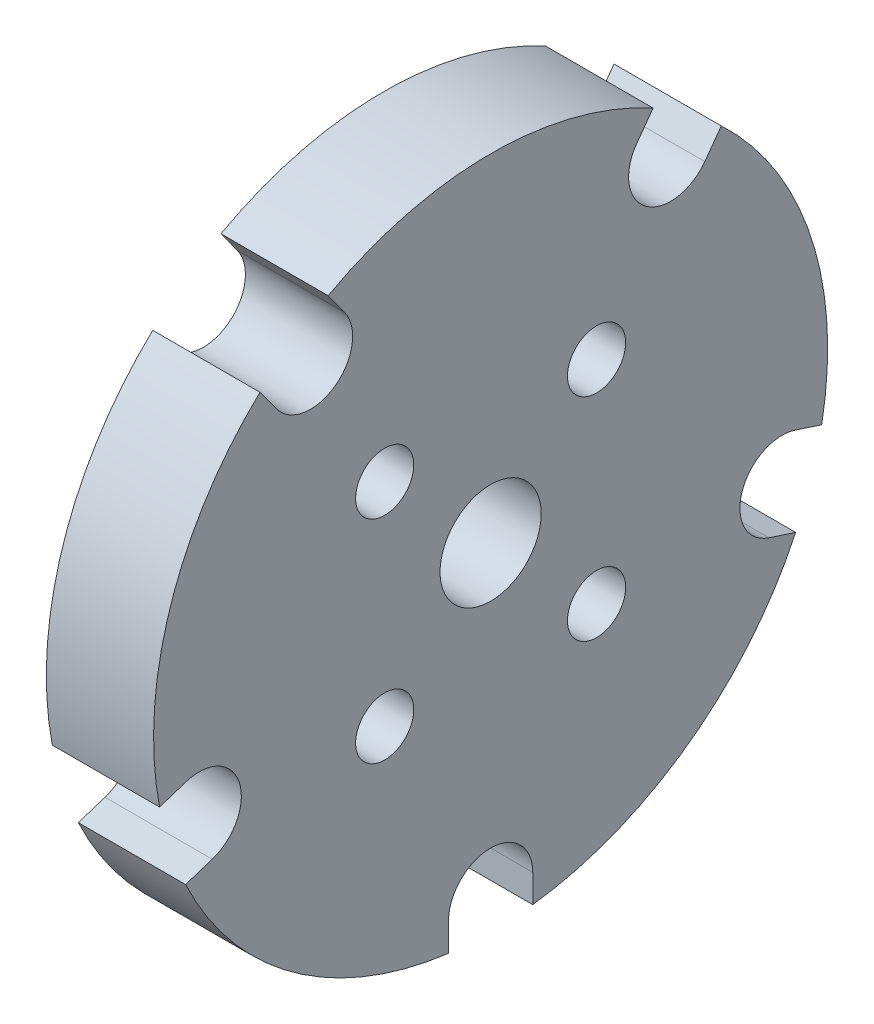
ISO-10303-21;
HEADER;
FILE_DESCRIPTION(('STEP AP214'),'2;1');
FILE_NAME('part.step','',(''),(''),'','','');
FILE_SCHEMA(('AUTOMOTIVE_DESIGN { 1 0 10303 214 1 1 1 1 }'));
ENDSEC;
DATA;
#1=APPLICATION_CONTEXT('core data for automotive mechanical design processes');
#2=APPLICATION_PROTOCOL_DEFINITION('international standard','automotive_design',2000,#1);
#3=PRODUCT_CONTEXT('',#1,'mechanical');
#4=PRODUCT('Part','Part','',(#3));
#5=PRODUCT_RELATED_PRODUCT_CATEGORY('part','',(#4));
#6=PRODUCT_DEFINITION_FORMATION('','',#4);
#7=PRODUCT_DEFINITION_CONTEXT('part definition',#1,'design');
#8=PRODUCT_DEFINITION('design','',#6,#7);
#9=PRODUCT_DEFINITION_SHAPE('','',#8);
#10=(LENGTH_UNIT() NAMED_UNIT(*) SI_UNIT(.MILLI.,.METRE.));
#11=(NAMED_UNIT(*) PLANE_ANGLE_UNIT() SI_UNIT($,.RADIAN.));
#12=(NAMED_UNIT(*) SI_UNIT($,.STERADIAN.) SOLID_ANGLE_UNIT());
#13=UNCERTAINTY_MEASURE_WITH_UNIT(LENGTH_MEASURE(1.E-05),#10,'distance_accuracy_value','');
#14=(GEOMETRIC_REPRESENTATION_CONTEXT(3) GLOBAL_UNCERTAINTY_ASSIGNED_CONTEXT((#13)) GLOBAL_UNIT_ASSIGNED_CONTEXT((#10,
#11,#12)) REPRESENTATION_CONTEXT('',''));
#15=CARTESIAN_POINT('',(0.,0.,0.));
#16=DIRECTION('',(0.,0.,1.));
#17=DIRECTION('',(1.,0.,0.));
#18=AXIS2_PLACEMENT_3D('',#15,#16,#17);
#19=CARTESIAN_POINT('',(7.,0.,0.));
#20=DIRECTION('',(1.,0.,0.));
#21=DIRECTION('',(0.,0.,-1.));
#22=AXIS2_PLACEMENT_3D('',#19,#20,#21);
#23=PLANE('',#22);
#24=CARTESIAN_POINT('',(7.,6.91479721322325,-6.91479721322325));
#25=DIRECTION('',(-1.,0.,0.));
#26=DIRECTION('',(0.,0.,1.));
#27=AXIS2_PLACEMENT_3D('',#24,#25,#26);
#28=CIRCLE('',#27,1.89865);
#29=CARTESIAN_POINT('',(7.,6.91479721322325,-5.01614721322325));
#30=VERTEX_POINT('',#29);
#31=EDGE_CURVE('E326',#30,#30,#28,.T.);
#32=ORIENTED_EDGE('',*,*,#31,.T.);
#33=EDGE_LOOP('',(#32));
#34=FACE_BOUND('',#33,.T.);
#35=CARTESIAN_POINT('',(7.,6.91479721322325,6.91479721322325));
#36=DIRECTION('',(-1.,0.,0.));
#37=DIRECTION('',(0.,0.,1.));
#38=AXIS2_PLACEMENT_3D('',#35,#36,#37);
#39=CIRCLE('',#38,1.89865);
#40=CARTESIAN_POINT('',(7.,6.91479721322325,8.81344721322325));
#41=VERTEX_POINT('',#40);
#42=EDGE_CURVE('E330',#41,#41,#39,.T.);
#43=ORIENTED_EDGE('',*,*,#42,.T.);
#44=EDGE_LOOP('',(#43));
#45=FACE_BOUND('',#44,.T.);
#46=CARTESIAN_POINT('',(7.,-6.91479721322325,6.91479721322325));
#47=DIRECTION('',(-1.,0.,0.));
#48=DIRECTION('',(0.,0.,1.));
#49=AXIS2_PLACEMENT_3D('',#46,#47,#48);
#50=CIRCLE('',#49,1.89865);
#51=CARTESIAN_POINT('',(7.,-6.91479721322325,8.81344721322325));
#52=VERTEX_POINT('',#51);
#53=EDGE_CURVE('E333',#52,#52,#50,.T.);
#54=ORIENTED_EDGE('',*,*,#53,.T.);
#55=EDGE_LOOP('',(#54));
#56=FACE_BOUND('',#55,.T.);
#57=DIRECTION('',(0.,0.309016994374944,0.951056516295155));
#58=VECTOR('',#57,1.);
#59=CARTESIAN_POINT('',(7.,-3.56493446768722,-19.8709270604342));
#60=LINE('',#59,#58);
#61=CARTESIAN_POINT('',(7.,-4.1296470537605,-21.6089336898276));
#62=VERTEX_POINT('',#61);
#63=CARTESIAN_POINT('',(7.,-3.56493446768722,-19.8709270604342));
#64=VERTEX_POINT('',#63);
#65=EDGE_CURVE('E183',#62,#64,#60,.T.);
#66=ORIENTED_EDGE('',*,*,#65,.F.);
#67=CARTESIAN_POINT('',(7.,0.,0.));
#68=DIRECTION('',(1.,0.,0.));
#69=DIRECTION('',(0.,0.,-1.));
#70=AXIS2_PLACEMENT_3D('',#67,#68,#69);
#71=CIRCLE('',#70,22.);
#72=CARTESIAN_POINT('',(7.,16.0423671879095,-15.0546489500183));
#73=VERTEX_POINT('',#72);
#74=EDGE_CURVE('E42',#62,#73,#71,.T.);
#75=ORIENTED_EDGE('',*,*,#74,.T.);
#76=DIRECTION('',(0.,0.809016994374951,-0.587785252292468));
#77=VECTOR('',#76,1.);
#78=CARTESIAN_POINT('',(7.,14.5639304436947,-13.9805017803805));
#79=LINE('',#78,#77);
#80=CARTESIAN_POINT('',(7.,14.5639304436947,-13.9805017803805));
#81=VERTEX_POINT('',#80);
#82=EDGE_CURVE('E380',#81,#73,#79,.T.);
#83=ORIENTED_EDGE('',*,*,#82,.F.);
#84=CARTESIAN_POINT('',(7.,16.180339887499,-11.7557050458494));
#85=DIRECTION('',(1.,0.,0.));
#86=DIRECTION('',(0.,0.587785252292469,0.809016994374951));
#87=AXIS2_PLACEMENT_3D('',#84,#85,#86);
#88=CIRCLE('',#87,2.75);
#89=CARTESIAN_POINT('',(7.,17.7967493313033,-9.53090831131825));
#90=VERTEX_POINT('',#89);
#91=EDGE_CURVE('E377',#90,#81,#88,.T.);
#92=ORIENTED_EDGE('',*,*,#91,.F.);
#93=DIRECTION('',(0.,-0.809016994374951,0.587785252292468));
#94=VECTOR('',#93,1.);
#95=CARTESIAN_POINT('',(7.,17.7967493313033,-9.53090831131825));
#96=LINE('',#95,#94);
#97=CARTESIAN_POINT('',(7.,19.275186075518,-10.605055480956));
#98=VERTEX_POINT('',#97);
#99=EDGE_CURVE('E382',#98,#90,#96,.T.);
#100=ORIENTED_EDGE('',*,*,#99,.F.);
#101=CARTESIAN_POINT('',(7.,19.2751860755179,10.6050554809563));
#102=VERTEX_POINT('',#101);
#103=EDGE_CURVE('E412',#98,#102,#71,.T.);
#104=ORIENTED_EDGE('',*,*,#103,.T.);
#105=DIRECTION('',(0.,0.809016994374942,0.58778525229248));
#106=VECTOR('',#105,1.);
#107=CARTESIAN_POINT('',(7.,17.7967493313032,9.53090831131852));
#108=LINE('',#107,#106);
#109=CARTESIAN_POINT('',(7.,17.7967493313032,9.53090831131852));
#110=VERTEX_POINT('',#109);
#111=EDGE_CURVE('E400',#110,#102,#108,.T.);
#112=ORIENTED_EDGE('',*,*,#111,.F.);
#113=CARTESIAN_POINT('',(7.,16.1803398874988,11.7557050458496));
#114=DIRECTION('',(1.,0.,0.));
#115=DIRECTION('',(0.,-0.58778525229248,0.809016994374942));
#116=AXIS2_PLACEMENT_3D('',#113,#114,#115);
#117=CIRCLE('',#116,2.75);
#118=CARTESIAN_POINT('',(7.,14.5639304436945,13.9805017803807));
#119=VERTEX_POINT('',#118);
#120=EDGE_CURVE('E397',#119,#110,#117,.T.);
#121=ORIENTED_EDGE('',*,*,#120,.F.);
#122=DIRECTION('',(0.,-0.809016994374942,-0.58778525229248));
#123=VECTOR('',#122,1.);
#124=CARTESIAN_POINT('',(7.,14.5639304436945,13.9805017803807));
#125=LINE('',#124,#123);
#126=CARTESIAN_POINT('',(7.,16.0423671879092,15.0546489500185));
#127=VERTEX_POINT('',#126);
#128=EDGE_CURVE('E402',#127,#119,#125,.T.);
#129=ORIENTED_EDGE('',*,*,#128,.F.);
#130=CARTESIAN_POINT('',(7.,-4.12964705376081,21.6089336898276));
#131=VERTEX_POINT('',#130);
#132=EDGE_CURVE('E229',#127,#131,#71,.T.);
#133=ORIENTED_EDGE('',*,*,#132,.T.);
#134=DIRECTION('',(0.,-0.309016994374959,0.95105651629515));
#135=VECTOR('',#134,1.);
#136=CARTESIAN_POINT('',(7.,-3.5649344676875,19.8709270604341));
#137=LINE('',#136,#135);
#138=CARTESIAN_POINT('',(7.,-3.5649344676875,19.8709270604341));
#139=VERTEX_POINT('',#138);
#140=EDGE_CURVE('E274',#139,#131,#137,.T.);
#141=ORIENTED_EDGE('',*,*,#140,.F.);
#142=CARTESIAN_POINT('',(7.,-6.18033988749916,19.021130325903));
#143=DIRECTION('',(1.,0.,0.));
#144=DIRECTION('',(0.,-0.95105651629515,-0.309016994374958));
#145=AXIS2_PLACEMENT_3D('',#142,#143,#144);
#146=CIRCLE('',#145,2.75);
#147=CARTESIAN_POINT('',(7.,-8.79574530731083,18.1713335913719));
#148=VERTEX_POINT('',#147);
#149=EDGE_CURVE('E271',#148,#139,#146,.T.);
#150=ORIENTED_EDGE('',*,*,#149,.F.);
#151=DIRECTION('',(0.,0.309016994374959,-0.95105651629515));
#152=VECTOR('',#151,1.);
#153=CARTESIAN_POINT('',(7.,-8.79574530731083,18.1713335913719));
#154=LINE('',#153,#152);
#155=CARTESIAN_POINT('',(7.,-9.36045789338414,19.9093402207653));
#156=VERTEX_POINT('',#155);
#157=EDGE_CURVE('E276',#156,#148,#154,.T.);
#158=ORIENTED_EDGE('',*,*,#157,.F.);
#159=CARTESIAN_POINT('',(7.,-21.8274483162829,2.75));
#160=VERTEX_POINT('',#159);
#161=EDGE_CURVE('E43',#156,#160,#71,.T.);
#162=ORIENTED_EDGE('',*,*,#161,.T.);
#163=DIRECTION('',(0.,-1.,0.));
#164=VECTOR('',#163,1.);
#165=CARTESIAN_POINT('',(7.,-20.,2.75));
#166=LINE('',#165,#164);
#167=CARTESIAN_POINT('',(7.,-20.,2.75));
#168=VERTEX_POINT('',#167);
#169=EDGE_CURVE('E205',#168,#160,#166,.T.);
#170=ORIENTED_EDGE('',*,*,#169,.F.);
#171=CARTESIAN_POINT('',(7.,-20.,0.));
#172=DIRECTION('',(1.,0.,0.));
#173=DIRECTION('',(0.,0.,-1.));
#174=AXIS2_PLACEMENT_3D('',#171,#172,#173);
#175=CIRCLE('',#174,2.75);
#176=CARTESIAN_POINT('',(7.,-20.,-2.75));
#177=VERTEX_POINT('',#176);
#178=EDGE_CURVE('E202',#177,#168,#175,.T.);
#179=ORIENTED_EDGE('',*,*,#178,.F.);
#180=DIRECTION('',(0.,1.,0.));
#181=VECTOR('',#180,1.);
#182=CARTESIAN_POINT('',(7.,-20.,-2.75));
#183=LINE('',#182,#181);
#184=CARTESIAN_POINT('',(7.,-21.8274483162829,-2.75));
#185=VERTEX_POINT('',#184);
#186=EDGE_CURVE('E199',#185,#177,#183,.T.);
#187=ORIENTED_EDGE('',*,*,#186,.F.);
#188=CARTESIAN_POINT('',(7.,-9.36045789338386,-19.9093402207654));
#189=VERTEX_POINT('',#188);
#190=EDGE_CURVE('E11',#185,#189,#71,.T.);
#191=ORIENTED_EDGE('',*,*,#190,.T.);
#192=DIRECTION('',(0.,-0.309016994374944,-0.951056516295155));
#193=VECTOR('',#192,1.);
#194=CARTESIAN_POINT('',(7.,-8.79574530731057,-18.171333591372));
#195=LINE('',#194,#193);
#196=CARTESIAN_POINT('',(7.,-8.79574530731057,-18.171333591372));
#197=VERTEX_POINT('',#196);
#198=EDGE_CURVE('E173',#197,#189,#195,.T.);
#199=ORIENTED_EDGE('',*,*,#198,.F.);
#200=CARTESIAN_POINT('',(7.,-6.1803398874989,-19.0211303259031));
#201=DIRECTION('',(1.,0.,0.));
#202=DIRECTION('',(0.,0.951056516295155,-0.309016994374945));
#203=AXIS2_PLACEMENT_3D('',#200,#201,#202);
#204=CIRCLE('',#203,2.75);
#205=EDGE_CURVE('E184',#64,#197,#204,.T.);
#206=ORIENTED_EDGE('',*,*,#205,.F.);
#207=EDGE_LOOP('',(#66,#75,#83,#92,#100,#104,#112,#121,#129,#133,#141,#150,#158,#162,#170,#179,
#187,#191,#199,#206));
#208=FACE_BOUND('',#207,.T.);
#209=CARTESIAN_POINT('',(7.,0.,0.));
#210=DIRECTION('',(1.,0.,0.));
#211=DIRECTION('',(0.,0.,-1.));
#212=AXIS2_PLACEMENT_3D('',#209,#210,#211);
#213=CIRCLE('',#212,3.3);
#214=CARTESIAN_POINT('',(7.,0.,-3.3));
#215=VERTEX_POINT('',#214);
#216=EDGE_CURVE('E354',#215,#215,#213,.T.);
#217=ORIENTED_EDGE('',*,*,#216,.F.);
#218=EDGE_LOOP('',(#217));
#219=FACE_BOUND('',#218,.T.);
#220=CARTESIAN_POINT('',(7.,-6.91479721322325,-6.91479721322325));
#221=DIRECTION('',(-1.,0.,0.));
#222=DIRECTION('',(0.,0.,1.));
#223=AXIS2_PLACEMENT_3D('',#220,#221,#222);
#224=CIRCLE('',#223,1.89865);
#225=CARTESIAN_POINT('',(7.,-6.91479721322325,-5.01614721322325));
#226=VERTEX_POINT('',#225);
#227=EDGE_CURVE('E351',#226,#226,#224,.T.);
#228=ORIENTED_EDGE('',*,*,#227,.T.);
#229=EDGE_LOOP('',(#228));
#230=FACE_BOUND('',#229,.T.);
#231=ADVANCED_FACE('F33',(#34,#45,#56,#208,#219,#230),#23,.T.);
#232=CARTESIAN_POINT('',(0.,0.,0.));
#233=DIRECTION('',(1.,0.,0.));
#234=DIRECTION('',(0.,0.,-1.));
#235=AXIS2_PLACEMENT_3D('',#232,#233,#234);
#236=PLANE('',#235);
#237=CARTESIAN_POINT('',(0.,6.91479721322325,-6.91479721322325));
#238=DIRECTION('',(-1.,0.,0.));
#239=DIRECTION('',(0.,0.,1.));
#240=AXIS2_PLACEMENT_3D('',#237,#238,#239);
#241=CIRCLE('',#240,3.77063);
#242=CARTESIAN_POINT('',(0.,6.91479721322325,-3.14416721322325));
#243=VERTEX_POINT('',#242);
#244=EDGE_CURVE('E521',#243,#243,#241,.T.);
#245=ORIENTED_EDGE('',*,*,#244,.F.);
#246=EDGE_LOOP('',(#245));
#247=FACE_BOUND('',#246,.T.);
#248=CARTESIAN_POINT('',(0.,6.91479721322325,6.91479721322325));
#249=DIRECTION('',(-1.,0.,0.));
#250=DIRECTION('',(0.,0.,1.));
#251=AXIS2_PLACEMENT_3D('',#248,#249,#250);
#252=CIRCLE('',#251,3.77063);
#253=CARTESIAN_POINT('',(0.,6.91479721322325,10.6854272132232));
#254=VERTEX_POINT('',#253);
#255=EDGE_CURVE('E529',#254,#254,#252,.T.);
#256=ORIENTED_EDGE('',*,*,#255,.F.);
#257=EDGE_LOOP('',(#256));
#258=FACE_BOUND('',#257,.T.);
#259=CARTESIAN_POINT('',(0.,-6.91479721322325,6.91479721322325));
#260=DIRECTION('',(-1.,0.,0.));
#261=DIRECTION('',(0.,0.,1.));
#262=AXIS2_PLACEMENT_3D('',#259,#260,#261);
#263=CIRCLE('',#262,3.77063);
#264=CARTESIAN_POINT('',(0.,-6.91479721322325,10.6854272132232));
#265=VERTEX_POINT('',#264);
#266=EDGE_CURVE('E539',#265,#265,#263,.T.);
#267=ORIENTED_EDGE('',*,*,#266,.F.);
#268=EDGE_LOOP('',(#267));
#269=FACE_BOUND('',#268,.T.);
#270=CARTESIAN_POINT('',(0.,0.,0.));
#271=DIRECTION('',(1.,0.,0.));
#272=DIRECTION('',(0.,0.,-1.));
#273=AXIS2_PLACEMENT_3D('',#270,#271,#272);
#274=CIRCLE('',#273,3.3);
#275=CARTESIAN_POINT('',(0.,0.,-3.3));
#276=VERTEX_POINT('',#275);
#277=EDGE_CURVE('E264',#276,#276,#274,.F.);
#278=ORIENTED_EDGE('',*,*,#277,.F.);
#279=EDGE_LOOP('',(#278));
#280=FACE_BOUND('',#279,.T.);
#281=CARTESIAN_POINT('',(0.,0.,0.));
#282=DIRECTION('',(1.,0.,0.));
#283=DIRECTION('',(0.,0.,-1.));
#284=AXIS2_PLACEMENT_3D('',#281,#282,#283);
#285=CIRCLE('',#284,22.);
#286=CARTESIAN_POINT('',(0.,-4.1296470537605,-21.6089336898276));
#287=VERTEX_POINT('',#286);
#288=CARTESIAN_POINT('',(0.,16.0423671879095,-15.0546489500183));
#289=VERTEX_POINT('',#288);
#290=EDGE_CURVE('E228',#287,#289,#285,.T.);
#291=ORIENTED_EDGE('',*,*,#290,.F.);
#292=DIRECTION('',(0.,-0.309016994374944,-0.951056516295155));
#293=VECTOR('',#292,1.);
#294=CARTESIAN_POINT('',(0.,-3.56493446768722,-19.8709270604342));
#295=LINE('',#294,#293);
#296=CARTESIAN_POINT('',(0.,-3.56493446768722,-19.8709270604342));
#297=VERTEX_POINT('',#296);
#298=EDGE_CURVE('E363',#297,#287,#295,.T.);
#299=ORIENTED_EDGE('',*,*,#298,.F.);
#300=CARTESIAN_POINT('',(0.,-6.1803398874989,-19.0211303259031));
#301=DIRECTION('',(1.,0.,0.));
#302=DIRECTION('',(0.,0.,-1.));
#303=AXIS2_PLACEMENT_3D('',#300,#301,#302);
#304=CIRCLE('',#303,2.75);
#305=CARTESIAN_POINT('',(0.,-8.79574530731057,-18.171333591372));
#306=VERTEX_POINT('',#305);
#307=EDGE_CURVE('E360',#306,#297,#304,.F.);
#308=ORIENTED_EDGE('',*,*,#307,.F.);
#309=DIRECTION('',(0.,0.309016994374944,0.951056516295155));
#310=VECTOR('',#309,1.);
#311=CARTESIAN_POINT('',(0.,-8.79574530731057,-18.171333591372));
#312=LINE('',#311,#310);
#313=CARTESIAN_POINT('',(0.,-9.36045789338386,-19.9093402207654));
#314=VERTEX_POINT('',#313);
#315=EDGE_CURVE('E288',#314,#306,#312,.T.);
#316=ORIENTED_EDGE('',*,*,#315,.F.);
#317=CARTESIAN_POINT('',(0.,-21.8274483162829,-2.75));
#318=VERTEX_POINT('',#317);
#319=EDGE_CURVE('E37',#318,#314,#285,.T.);
#320=ORIENTED_EDGE('',*,*,#319,.F.);
#321=DIRECTION('',(0.,-1.,0.));
#322=VECTOR('',#321,1.);
#323=CARTESIAN_POINT('',(0.,-20.,-2.75));
#324=LINE('',#323,#322);
#325=CARTESIAN_POINT('',(0.,-20.,-2.75));
#326=VERTEX_POINT('',#325);
#327=EDGE_CURVE('E293',#326,#318,#324,.T.);
#328=ORIENTED_EDGE('',*,*,#327,.F.);
#329=CARTESIAN_POINT('',(0.,-20.,0.));
#330=DIRECTION('',(1.,0.,0.));
#331=DIRECTION('',(0.,0.,-1.));
#332=AXIS2_PLACEMENT_3D('',#329,#330,#331);
#333=CIRCLE('',#332,2.75);
#334=CARTESIAN_POINT('',(0.,-20.,2.75));
#335=VERTEX_POINT('',#334);
#336=EDGE_CURVE('E290',#335,#326,#333,.F.);
#337=ORIENTED_EDGE('',*,*,#336,.F.);
#338=DIRECTION('',(0.,1.,0.));
#339=VECTOR('',#338,1.);
#340=CARTESIAN_POINT('',(0.,-20.,2.75));
#341=LINE('',#340,#339);
#342=CARTESIAN_POINT('',(0.,-21.8274483162829,2.75));
#343=VERTEX_POINT('',#342);
#344=EDGE_CURVE('E213',#343,#335,#341,.T.);
#345=ORIENTED_EDGE('',*,*,#344,.F.);
#346=CARTESIAN_POINT('',(0.,-9.36045789338414,19.9093402207653));
#347=VERTEX_POINT('',#346);
#348=EDGE_CURVE('E216',#347,#343,#285,.T.);
#349=ORIENTED_EDGE('',*,*,#348,.F.);
#350=DIRECTION('',(0.,-0.309016994374959,0.95105651629515));
#351=VECTOR('',#350,1.);
#352=CARTESIAN_POINT('',(0.,-8.79574530731083,18.1713335913719));
#353=LINE('',#352,#351);
#354=CARTESIAN_POINT('',(0.,-8.79574530731083,18.1713335913719));
#355=VERTEX_POINT('',#354);
#356=EDGE_CURVE('E269',#355,#347,#353,.T.);
#357=ORIENTED_EDGE('',*,*,#356,.F.);
#358=CARTESIAN_POINT('',(0.,-6.18033988749916,19.021130325903));
#359=DIRECTION('',(1.,0.,0.));
#360=DIRECTION('',(0.,0.,-1.));
#361=AXIS2_PLACEMENT_3D('',#358,#359,#360);
#362=CIRCLE('',#361,2.75);
#363=CARTESIAN_POINT('',(0.,-3.5649344676875,19.8709270604341));
#364=VERTEX_POINT('',#363);
#365=EDGE_CURVE('E266',#364,#355,#362,.F.);
#366=ORIENTED_EDGE('',*,*,#365,.F.);
#367=DIRECTION('',(0.,0.309016994374959,-0.95105651629515));
#368=VECTOR('',#367,1.);
#369=CARTESIAN_POINT('',(0.,-3.5649344676875,19.8709270604341));
#370=LINE('',#369,#368);
#371=CARTESIAN_POINT('',(0.,-4.12964705376081,21.6089336898276));
#372=VERTEX_POINT('',#371);
#373=EDGE_CURVE('E282',#372,#364,#370,.T.);
#374=ORIENTED_EDGE('',*,*,#373,.F.);
#375=CARTESIAN_POINT('',(0.,16.0423671879092,15.0546489500185));
#376=VERTEX_POINT('',#375);
#377=EDGE_CURVE('E221',#376,#372,#285,.T.);
#378=ORIENTED_EDGE('',*,*,#377,.F.);
#379=DIRECTION('',(0.,0.809016994374942,0.587785252292481));
#380=VECTOR('',#379,1.);
#381=CARTESIAN_POINT('',(0.,14.5639304436945,13.9805017803807));
#382=LINE('',#381,#380);
#383=CARTESIAN_POINT('',(0.,14.5639304436945,13.9805017803807));
#384=VERTEX_POINT('',#383);
#385=EDGE_CURVE('E395',#384,#376,#382,.T.);
#386=ORIENTED_EDGE('',*,*,#385,.F.);
#387=CARTESIAN_POINT('',(0.,16.1803398874988,11.7557050458496));
#388=DIRECTION('',(1.,0.,0.));
#389=DIRECTION('',(0.,0.,-1.));
#390=AXIS2_PLACEMENT_3D('',#387,#388,#389);
#391=CIRCLE('',#390,2.75);
#392=CARTESIAN_POINT('',(0.,17.7967493313032,9.53090831131852));
#393=VERTEX_POINT('',#392);
#394=EDGE_CURVE('E253',#393,#384,#391,.F.);
#395=ORIENTED_EDGE('',*,*,#394,.F.);
#396=DIRECTION('',(0.,-0.809016994374942,-0.587785252292481));
#397=VECTOR('',#396,1.);
#398=CARTESIAN_POINT('',(0.,17.7967493313032,9.53090831131852));
#399=LINE('',#398,#397);
#400=CARTESIAN_POINT('',(0.,19.2751860755179,10.6050554809563));
#401=VERTEX_POINT('',#400);
#402=EDGE_CURVE('E250',#401,#393,#399,.T.);
#403=ORIENTED_EDGE('',*,*,#402,.F.);
#404=CARTESIAN_POINT('',(0.,19.275186075518,-10.605055480956));
#405=VERTEX_POINT('',#404);
#406=EDGE_CURVE('E227',#405,#401,#285,.T.);
#407=ORIENTED_EDGE('',*,*,#406,.F.);
#408=DIRECTION('',(0.,0.809016994374951,-0.587785252292468));
#409=VECTOR('',#408,1.);
#410=CARTESIAN_POINT('',(0.,17.7967493313033,-9.53090831131825));
#411=LINE('',#410,#409);
#412=CARTESIAN_POINT('',(0.,17.7967493313033,-9.53090831131825));
#413=VERTEX_POINT('',#412);
#414=EDGE_CURVE('E248',#413,#405,#411,.T.);
#415=ORIENTED_EDGE('',*,*,#414,.F.);
#416=CARTESIAN_POINT('',(0.,16.180339887499,-11.7557050458494));
#417=DIRECTION('',(1.,0.,0.));
#418=DIRECTION('',(0.,0.,-1.));
#419=AXIS2_PLACEMENT_3D('',#416,#417,#418);
#420=CIRCLE('',#419,2.75);
#421=CARTESIAN_POINT('',(0.,14.5639304436947,-13.9805017803805));
#422=VERTEX_POINT('',#421);
#423=EDGE_CURVE('E373',#422,#413,#420,.F.);
#424=ORIENTED_EDGE('',*,*,#423,.F.);
#425=DIRECTION('',(0.,-0.809016994374951,0.587785252292468));
#426=VECTOR('',#425,1.);
#427=CARTESIAN_POINT('',(0.,14.5639304436947,-13.9805017803805));
#428=LINE('',#427,#426);
#429=EDGE_CURVE('E192',#289,#422,#428,.T.);
#430=ORIENTED_EDGE('',*,*,#429,.F.);
#431=EDGE_LOOP('',(#291,#299,#308,#316,#320,#328,#337,#345,#349,#357,#366,#374,#378,#386,#395,
#403,#407,#415,#424,#430));
#432=FACE_BOUND('',#431,.T.);
#433=CARTESIAN_POINT('',(0.,-6.91479721322325,-6.91479721322325));
#434=DIRECTION('',(-1.,0.,0.));
#435=DIRECTION('',(0.,0.,1.));
#436=AXIS2_PLACEMENT_3D('',#433,#434,#435);
#437=CIRCLE('',#436,3.77063);
#438=CARTESIAN_POINT('',(0.,-6.91479721322325,-3.14416721322325));
#439=VERTEX_POINT('',#438);
#440=EDGE_CURVE('E335',#439,#439,#437,.T.);
#441=ORIENTED_EDGE('',*,*,#440,.F.);
#442=EDGE_LOOP('',(#441));
#443=FACE_BOUND('',#442,.T.);
#444=ADVANCED_FACE('F245',(#247,#258,#269,#280,#432,#443),#236,.F.);
#445=CARTESIAN_POINT('',(7.,0.,0.));
#446=DIRECTION('',(-1.,0.,0.));
#447=DIRECTION('',(0.,0.,1.));
#448=AXIS2_PLACEMENT_3D('',#445,#446,#447);
#449=CYLINDRICAL_SURFACE('',#448,22.);
#450=ORIENTED_EDGE('',*,*,#74,.F.);
#451=DIRECTION('',(-1.,0.,0.));
#452=VECTOR('',#451,1.);
#453=CARTESIAN_POINT('',(7.,-4.1296470537605,-21.6089336898276));
#454=LINE('',#453,#452);
#455=EDGE_CURVE('E191',#287,#62,#454,.F.);
#456=ORIENTED_EDGE('',*,*,#455,.F.);
#457=ORIENTED_EDGE('',*,*,#290,.T.);
#458=DIRECTION('',(-1.,0.,0.));
#459=VECTOR('',#458,1.);
#460=CARTESIAN_POINT('',(7.,16.0423671879095,-15.0546489500183));
#461=LINE('',#460,#459);
#462=EDGE_CURVE('E254',#73,#289,#461,.T.);
#463=ORIENTED_EDGE('',*,*,#462,.F.);
#464=EDGE_LOOP('',(#450,#456,#457,#463));
#465=FACE_BOUND('',#464,.T.);
#466=ADVANCED_FACE('F321',(#465),#449,.T.);
#467=ORIENTED_EDGE('',*,*,#103,.F.);
#468=DIRECTION('',(-1.,0.,0.));
#469=VECTOR('',#468,1.);
#470=CARTESIAN_POINT('',(7.,19.275186075518,-10.605055480956));
#471=LINE('',#470,#469);
#472=EDGE_CURVE('E242',#405,#98,#471,.F.);
#473=ORIENTED_EDGE('',*,*,#472,.F.);
#474=ORIENTED_EDGE('',*,*,#406,.T.);
#475=DIRECTION('',(-1.,0.,0.));
#476=VECTOR('',#475,1.);
#477=CARTESIAN_POINT('',(7.,19.2751860755179,10.6050554809563));
#478=LINE('',#477,#476);
#479=EDGE_CURVE('E58',#102,#401,#478,.T.);
#480=ORIENTED_EDGE('',*,*,#479,.F.);
#481=EDGE_LOOP('',(#467,#473,#474,#480));
#482=FACE_BOUND('',#481,.T.);
#483=ADVANCED_FACE('F240',(#482),#449,.T.);
#484=ORIENTED_EDGE('',*,*,#132,.F.);
#485=DIRECTION('',(-1.,0.,0.));
#486=VECTOR('',#485,1.);
#487=CARTESIAN_POINT('',(7.,16.0423671879092,15.0546489500185));
#488=LINE('',#487,#486);
#489=EDGE_CURVE('E392',#376,#127,#488,.F.);
#490=ORIENTED_EDGE('',*,*,#489,.F.);
#491=ORIENTED_EDGE('',*,*,#377,.T.);
#492=DIRECTION('',(-1.,0.,0.));
#493=VECTOR('',#492,1.);
#494=CARTESIAN_POINT('',(7.,-4.12964705376081,21.6089336898276));
#495=LINE('',#494,#493);
#496=EDGE_CURVE('E50',#131,#372,#495,.T.);
#497=ORIENTED_EDGE('',*,*,#496,.F.);
#498=EDGE_LOOP('',(#484,#490,#491,#497));
#499=FACE_BOUND('',#498,.T.);
#500=ADVANCED_FACE('F421',(#499),#449,.T.);
#501=ORIENTED_EDGE('',*,*,#161,.F.);
#502=DIRECTION('',(-1.,0.,0.));
#503=VECTOR('',#502,1.);
#504=CARTESIAN_POINT('',(7.,-9.36045789338414,19.9093402207653));
#505=LINE('',#504,#503);
#506=EDGE_CURVE('E263',#347,#156,#505,.F.);
#507=ORIENTED_EDGE('',*,*,#506,.F.);
#508=ORIENTED_EDGE('',*,*,#348,.T.);
#509=DIRECTION('',(-1.,0.,0.));
#510=VECTOR('',#509,1.);
#511=CARTESIAN_POINT('',(7.,-21.8274483162829,2.75));
#512=LINE('',#511,#510);
#513=EDGE_CURVE('E285',#160,#343,#512,.T.);
#514=ORIENTED_EDGE('',*,*,#513,.F.);
#515=EDGE_LOOP('',(#501,#507,#508,#514));
#516=FACE_BOUND('',#515,.T.);
#517=ADVANCED_FACE('F299',(#516),#449,.T.);
#518=ORIENTED_EDGE('',*,*,#319,.T.);
#519=DIRECTION('',(-1.,0.,0.));
#520=VECTOR('',#519,1.);
#521=CARTESIAN_POINT('',(7.,-9.36045789338386,-19.9093402207654));
#522=LINE('',#521,#520);
#523=EDGE_CURVE('E177',#189,#314,#522,.T.);
#524=ORIENTED_EDGE('',*,*,#523,.F.);
#525=ORIENTED_EDGE('',*,*,#190,.F.);
#526=DIRECTION('',(-1.,0.,0.));
#527=VECTOR('',#526,1.);
#528=CARTESIAN_POINT('',(7.,-21.8274483162829,-2.75));
#529=LINE('',#528,#527);
#530=EDGE_CURVE('E287',#318,#185,#529,.F.);
#531=ORIENTED_EDGE('',*,*,#530,.F.);
#532=EDGE_LOOP('',(#518,#524,#525,#531));
#533=FACE_BOUND('',#532,.T.);
#534=ADVANCED_FACE('F35',(#533),#449,.T.);
#535=CARTESIAN_POINT('',(-0.00100000000000013,-20.,0.));
#536=DIRECTION('',(1.,0.,0.));
#537=DIRECTION('',(0.,0.,-1.));
#538=AXIS2_PLACEMENT_3D('',#535,#536,#537);
#539=CYLINDRICAL_SURFACE('',#538,2.75);
#540=ORIENTED_EDGE('',*,*,#336,.T.);
#541=DIRECTION('',(1.,0.,0.));
#542=VECTOR('',#541,1.);
#543=CARTESIAN_POINT('',(-0.00100000000000013,-20.,-2.75));
#544=LINE('',#543,#542);
#545=EDGE_CURVE('E207',#326,#177,#544,.T.);
#546=ORIENTED_EDGE('',*,*,#545,.T.);
#547=ORIENTED_EDGE('',*,*,#178,.T.);
#548=DIRECTION('',(1.,0.,0.));
#549=VECTOR('',#548,1.);
#550=CARTESIAN_POINT('',(-0.00100000000000013,-20.,2.75));
#551=LINE('',#550,#549);
#552=EDGE_CURVE('E204',#335,#168,#551,.T.);
#553=ORIENTED_EDGE('',*,*,#552,.F.);
#554=EDGE_LOOP('',(#540,#546,#547,#553));
#555=FACE_BOUND('',#554,.T.);
#556=ADVANCED_FACE('F295',(#555),#539,.F.);
#557=CARTESIAN_POINT('',(-0.00100000000000013,-20.,-2.75));
#558=DIRECTION('',(0.,0.,-1.));
#559=DIRECTION('',(0.,1.,0.));
#560=AXIS2_PLACEMENT_3D('',#557,#558,#559);
#561=PLANE('',#560);
#562=ORIENTED_EDGE('',*,*,#530,.T.);
#563=ORIENTED_EDGE('',*,*,#186,.T.);
#564=ORIENTED_EDGE('',*,*,#545,.F.);
#565=ORIENTED_EDGE('',*,*,#327,.T.);
#566=EDGE_LOOP('',(#562,#563,#564,#565));
#567=FACE_BOUND('',#566,.T.);
#568=ADVANCED_FACE('F304',(#567),#561,.F.);
#569=CARTESIAN_POINT('',(-0.00100000000000013,-20.,2.75));
#570=DIRECTION('',(0.,0.,1.));
#571=DIRECTION('',(0.,-1.,0.));
#572=AXIS2_PLACEMENT_3D('',#569,#570,#571);
#573=PLANE('',#572);
#574=ORIENTED_EDGE('',*,*,#513,.T.);
#575=ORIENTED_EDGE('',*,*,#344,.T.);
#576=ORIENTED_EDGE('',*,*,#552,.T.);
#577=ORIENTED_EDGE('',*,*,#169,.T.);
#578=EDGE_LOOP('',(#574,#575,#576,#577));
#579=FACE_BOUND('',#578,.T.);
#580=ADVANCED_FACE('F298',(#579),#573,.F.);
#581=CARTESIAN_POINT('',(-0.00100000000000013,-6.18033988749916,19.021130325903));
#582=DIRECTION('',(1.,0.,0.));
#583=DIRECTION('',(0.,0.,-1.));
#584=AXIS2_PLACEMENT_3D('',#581,#582,#583);
#585=CYLINDRICAL_SURFACE('',#584,2.75);
#586=ORIENTED_EDGE('',*,*,#365,.T.);
#587=DIRECTION('',(1.,0.,0.));
#588=VECTOR('',#587,1.);
#589=CARTESIAN_POINT('',(-0.00100000000000013,-8.79574530731083,18.1713335913719));
#590=LINE('',#589,#588);
#591=EDGE_CURVE('E280',#355,#148,#590,.T.);
#592=ORIENTED_EDGE('',*,*,#591,.T.);
#593=ORIENTED_EDGE('',*,*,#149,.T.);
#594=DIRECTION('',(1.,0.,0.));
#595=VECTOR('',#594,1.);
#596=CARTESIAN_POINT('',(-0.00100000000000013,-3.5649344676875,19.8709270604341));
#597=LINE('',#596,#595);
#598=EDGE_CURVE('E279',#364,#139,#597,.T.);
#599=ORIENTED_EDGE('',*,*,#598,.F.);
#600=EDGE_LOOP('',(#586,#592,#593,#599));
#601=FACE_BOUND('',#600,.T.);
#602=ADVANCED_FACE('F311',(#601),#585,.F.);
#603=CARTESIAN_POINT('',(-0.00100000000000013,-8.79574530731083,18.1713335913719));
#604=DIRECTION('',(0.,-0.95105651629515,-0.309016994374958));
#605=DIRECTION('',(0.,0.309016994374959,-0.95105651629515));
#606=AXIS2_PLACEMENT_3D('',#603,#604,#605);
#607=PLANE('',#606);
#608=ORIENTED_EDGE('',*,*,#506,.T.);
#609=ORIENTED_EDGE('',*,*,#157,.T.);
#610=ORIENTED_EDGE('',*,*,#591,.F.);
#611=ORIENTED_EDGE('',*,*,#356,.T.);
#612=EDGE_LOOP('',(#608,#609,#610,#611));
#613=FACE_BOUND('',#612,.T.);
#614=ADVANCED_FACE('F425',(#613),#607,.F.);
#615=CARTESIAN_POINT('',(-0.00100000000000013,-3.5649344676875,19.8709270604341));
#616=DIRECTION('',(0.,0.95105651629515,0.309016994374958));
#617=DIRECTION('',(0.,-0.309016994374959,0.95105651629515));
#618=AXIS2_PLACEMENT_3D('',#615,#616,#617);
#619=PLANE('',#618);
#620=ORIENTED_EDGE('',*,*,#496,.T.);
#621=ORIENTED_EDGE('',*,*,#373,.T.);
#622=ORIENTED_EDGE('',*,*,#598,.T.);
#623=ORIENTED_EDGE('',*,*,#140,.T.);
#624=EDGE_LOOP('',(#620,#621,#622,#623));
#625=FACE_BOUND('',#624,.T.);
#626=ADVANCED_FACE('F423',(#625),#619,.F.);
#627=CARTESIAN_POINT('',(-0.00100000000000013,16.1803398874988,11.7557050458496));
#628=DIRECTION('',(1.,0.,0.));
#629=DIRECTION('',(0.,0.,-1.));
#630=AXIS2_PLACEMENT_3D('',#627,#628,#629);
#631=CYLINDRICAL_SURFACE('',#630,2.75);
#632=ORIENTED_EDGE('',*,*,#394,.T.);
#633=DIRECTION('',(1.,0.,0.));
#634=VECTOR('',#633,1.);
#635=CARTESIAN_POINT('',(-0.00100000000000013,14.5639304436945,13.9805017803807));
#636=LINE('',#635,#634);
#637=EDGE_CURVE('E255',#384,#119,#636,.T.);
#638=ORIENTED_EDGE('',*,*,#637,.T.);
#639=ORIENTED_EDGE('',*,*,#120,.T.);
#640=DIRECTION('',(1.,0.,0.));
#641=VECTOR('',#640,1.);
#642=CARTESIAN_POINT('',(-0.00100000000000013,17.7967493313032,9.53090831131852));
#643=LINE('',#642,#641);
#644=EDGE_CURVE('E258',#393,#110,#643,.T.);
#645=ORIENTED_EDGE('',*,*,#644,.F.);
#646=EDGE_LOOP('',(#632,#638,#639,#645));
#647=FACE_BOUND('',#646,.T.);
#648=ADVANCED_FACE('F410',(#647),#631,.F.);
#649=CARTESIAN_POINT('',(-0.00100000000000013,14.5639304436945,13.9805017803807));
#650=DIRECTION('',(0.,-0.58778525229248,0.809016994374942));
#651=DIRECTION('',(0.,-0.809016994374942,-0.587785252292481));
#652=AXIS2_PLACEMENT_3D('',#649,#650,#651);
#653=PLANE('',#652);
#654=ORIENTED_EDGE('',*,*,#489,.T.);
#655=ORIENTED_EDGE('',*,*,#128,.T.);
#656=ORIENTED_EDGE('',*,*,#637,.F.);
#657=ORIENTED_EDGE('',*,*,#385,.T.);
#658=EDGE_LOOP('',(#654,#655,#656,#657));
#659=FACE_BOUND('',#658,.T.);
#660=ADVANCED_FACE('F436',(#659),#653,.F.);
#661=CARTESIAN_POINT('',(-0.00100000000000013,17.7967493313032,9.53090831131852));
#662=DIRECTION('',(0.,0.58778525229248,-0.809016994374942));
#663=DIRECTION('',(0.,0.809016994374942,0.587785252292481));
#664=AXIS2_PLACEMENT_3D('',#661,#662,#663);
#665=PLANE('',#664);
#666=ORIENTED_EDGE('',*,*,#479,.T.);
#667=ORIENTED_EDGE('',*,*,#402,.T.);
#668=ORIENTED_EDGE('',*,*,#644,.T.);
#669=ORIENTED_EDGE('',*,*,#111,.T.);
#670=EDGE_LOOP('',(#666,#667,#668,#669));
#671=FACE_BOUND('',#670,.T.);
#672=ADVANCED_FACE('F407',(#671),#665,.F.);
#673=CARTESIAN_POINT('',(-0.00100000000000013,16.180339887499,-11.7557050458494));
#674=DIRECTION('',(1.,0.,0.));
#675=DIRECTION('',(0.,0.,-1.));
#676=AXIS2_PLACEMENT_3D('',#673,#674,#675);
#677=CYLINDRICAL_SURFACE('',#676,2.75);
#678=ORIENTED_EDGE('',*,*,#423,.T.);
#679=DIRECTION('',(1.,0.,0.));
#680=VECTOR('',#679,1.);
#681=CARTESIAN_POINT('',(-0.00100000000000013,17.7967493313033,-9.53090831131825));
#682=LINE('',#681,#680);
#683=EDGE_CURVE('E386',#413,#90,#682,.T.);
#684=ORIENTED_EDGE('',*,*,#683,.T.);
#685=ORIENTED_EDGE('',*,*,#91,.T.);
#686=DIRECTION('',(1.,0.,0.));
#687=VECTOR('',#686,1.);
#688=CARTESIAN_POINT('',(-0.00100000000000013,14.5639304436947,-13.9805017803805));
#689=LINE('',#688,#687);
#690=EDGE_CURVE('E385',#422,#81,#689,.T.);
#691=ORIENTED_EDGE('',*,*,#690,.F.);
#692=EDGE_LOOP('',(#678,#684,#685,#691));
#693=FACE_BOUND('',#692,.T.);
#694=ADVANCED_FACE('F439',(#693),#677,.F.);
#695=CARTESIAN_POINT('',(-0.00100000000000013,17.7967493313033,-9.53090831131825));
#696=DIRECTION('',(0.,0.587785252292468,0.809016994374951));
#697=DIRECTION('',(0.,-0.809016994374951,0.587785252292468));
#698=AXIS2_PLACEMENT_3D('',#695,#696,#697);
#699=PLANE('',#698);
#700=ORIENTED_EDGE('',*,*,#472,.T.);
#701=ORIENTED_EDGE('',*,*,#99,.T.);
#702=ORIENTED_EDGE('',*,*,#683,.F.);
#703=ORIENTED_EDGE('',*,*,#414,.T.);
#704=EDGE_LOOP('',(#700,#701,#702,#703));
#705=FACE_BOUND('',#704,.T.);
#706=ADVANCED_FACE('F444',(#705),#699,.F.);
#707=CARTESIAN_POINT('',(-0.00100000000000013,14.5639304436947,-13.9805017803805));
#708=DIRECTION('',(0.,-0.587785252292468,-0.809016994374951));
#709=DIRECTION('',(0.,0.809016994374951,-0.587785252292468));
#710=AXIS2_PLACEMENT_3D('',#707,#708,#709);
#711=PLANE('',#710);
#712=ORIENTED_EDGE('',*,*,#462,.T.);
#713=ORIENTED_EDGE('',*,*,#429,.T.);
#714=ORIENTED_EDGE('',*,*,#690,.T.);
#715=ORIENTED_EDGE('',*,*,#82,.T.);
#716=EDGE_LOOP('',(#712,#713,#714,#715));
#717=FACE_BOUND('',#716,.T.);
#718=ADVANCED_FACE('F446',(#717),#711,.F.);
#719=CARTESIAN_POINT('',(-0.00100000000000013,-6.1803398874989,-19.0211303259031));
#720=DIRECTION('',(1.,0.,0.));
#721=DIRECTION('',(0.,0.,-1.));
#722=AXIS2_PLACEMENT_3D('',#719,#720,#721);
#723=CYLINDRICAL_SURFACE('',#722,2.75);
#724=ORIENTED_EDGE('',*,*,#307,.T.);
#725=DIRECTION('',(1.,0.,0.));
#726=VECTOR('',#725,1.);
#727=CARTESIAN_POINT('',(-0.00100000000000013,-3.56493446768722,-19.8709270604342));
#728=LINE('',#727,#726);
#729=EDGE_CURVE('E368',#297,#64,#728,.T.);
#730=ORIENTED_EDGE('',*,*,#729,.T.);
#731=ORIENTED_EDGE('',*,*,#205,.T.);
#732=DIRECTION('',(1.,0.,0.));
#733=VECTOR('',#732,1.);
#734=CARTESIAN_POINT('',(-0.00100000000000013,-8.79574530731057,-18.171333591372));
#735=LINE('',#734,#733);
#736=EDGE_CURVE('E179',#306,#197,#735,.T.);
#737=ORIENTED_EDGE('',*,*,#736,.F.);
#738=EDGE_LOOP('',(#724,#730,#731,#737));
#739=FACE_BOUND('',#738,.T.);
#740=ADVANCED_FACE('F449',(#739),#723,.F.);
#741=CARTESIAN_POINT('',(-0.00100000000000013,-3.56493446768722,-19.8709270604342));
#742=DIRECTION('',(0.,0.951056516295155,-0.309016994374944));
#743=DIRECTION('',(0.,0.309016994374944,0.951056516295155));
#744=AXIS2_PLACEMENT_3D('',#741,#742,#743);
#745=PLANE('',#744);
#746=ORIENTED_EDGE('',*,*,#455,.T.);
#747=ORIENTED_EDGE('',*,*,#65,.T.);
#748=ORIENTED_EDGE('',*,*,#729,.F.);
#749=ORIENTED_EDGE('',*,*,#298,.T.);
#750=EDGE_LOOP('',(#746,#747,#748,#749));
#751=FACE_BOUND('',#750,.T.);
#752=ADVANCED_FACE('F456',(#751),#745,.F.);
#753=CARTESIAN_POINT('',(-0.00100000000000013,-8.79574530731057,-18.171333591372));
#754=DIRECTION('',(0.,-0.951056516295155,0.309016994374944));
#755=DIRECTION('',(0.,-0.309016994374944,-0.951056516295155));
#756=AXIS2_PLACEMENT_3D('',#753,#754,#755);
#757=PLANE('',#756);
#758=ORIENTED_EDGE('',*,*,#523,.T.);
#759=ORIENTED_EDGE('',*,*,#315,.T.);
#760=ORIENTED_EDGE('',*,*,#736,.T.);
#761=ORIENTED_EDGE('',*,*,#198,.T.);
#762=EDGE_LOOP('',(#758,#759,#760,#761));
#763=FACE_BOUND('',#762,.T.);
#764=ADVANCED_FACE('F175',(#763),#757,.F.);
#765=CARTESIAN_POINT('',(-0.00100000000000013,0.,0.));
#766=DIRECTION('',(1.,0.,0.));
#767=DIRECTION('',(0.,0.,-1.));
#768=AXIS2_PLACEMENT_3D('',#765,#766,#767);
#769=CYLINDRICAL_SURFACE('',#768,3.3);
#770=ORIENTED_EDGE('',*,*,#216,.T.);
#771=EDGE_LOOP('',(#770));
#772=FACE_BOUND('',#771,.T.);
#773=ORIENTED_EDGE('',*,*,#277,.T.);
#774=EDGE_LOOP('',(#773));
#775=FACE_BOUND('',#774,.T.);
#776=ADVANCED_FACE('F460',(#772,#775),#769,.F.);
#777=CARTESIAN_POINT('',(0.,-6.91479721322325,-6.91479721322325));
#778=DIRECTION('',(-1.,0.,0.));
#779=DIRECTION('',(0.,0.,1.));
#780=AXIS2_PLACEMENT_3D('',#777,#778,#779);
#781=CYLINDRICAL_SURFACE('',#780,1.89865);
#782=ORIENTED_EDGE('',*,*,#227,.F.);
#783=EDGE_LOOP('',(#782));
#784=FACE_BOUND('',#783,.T.);
#785=CARTESIAN_POINT('',(2.4638,-6.91479721322325,-6.91479721322325));
#786=DIRECTION('',(-1.,0.,0.));
#787=DIRECTION('',(0.,0.,1.));
#788=AXIS2_PLACEMENT_3D('',#785,#786,#787);
#789=CIRCLE('',#788,1.89865);
#790=CARTESIAN_POINT('',(2.4638,-6.91479721322325,-5.01614721322325));
#791=VERTEX_POINT('',#790);
#792=EDGE_CURVE('E348',#791,#791,#789,.T.);
#793=ORIENTED_EDGE('',*,*,#792,.T.);
#794=EDGE_LOOP('',(#793));
#795=FACE_BOUND('',#794,.T.);
#796=ADVANCED_FACE('F466',(#784,#795),#781,.F.);
#797=CARTESIAN_POINT('',(2.4638,-5.01614721322325,-6.91479721322325));
#798=DIRECTION('',(1.,0.,0.));
#799=DIRECTION('',(0.,0.,-1.));
#800=AXIS2_PLACEMENT_3D('',#797,#798,#799);
#801=PLANE('',#800);
#802=ORIENTED_EDGE('',*,*,#792,.F.);
#803=EDGE_LOOP('',(#802));
#804=FACE_BOUND('',#803,.T.);
#805=CARTESIAN_POINT('',(2.4638,-6.91479721322325,-6.91479721322325));
#806=DIRECTION('',(-1.,0.,0.));
#807=DIRECTION('',(0.,0.,1.));
#808=AXIS2_PLACEMENT_3D('',#805,#806,#807);
#809=CIRCLE('',#808,3.77063);
#810=CARTESIAN_POINT('',(2.4638,-6.91479721322325,-3.14416721322325));
#811=VERTEX_POINT('',#810);
#812=EDGE_CURVE('E339',#811,#811,#809,.T.);
#813=ORIENTED_EDGE('',*,*,#812,.T.);
#814=EDGE_LOOP('',(#813));
#815=FACE_BOUND('',#814,.T.);
#816=ADVANCED_FACE('F470',(#804,#815),#801,.F.);
#817=CARTESIAN_POINT('',(0.,-6.91479721322325,-6.91479721322325));
#818=DIRECTION('',(-1.,0.,0.));
#819=DIRECTION('',(0.,0.,1.));
#820=AXIS2_PLACEMENT_3D('',#817,#818,#819);
#821=CYLINDRICAL_SURFACE('',#820,3.77063);
#822=ORIENTED_EDGE('',*,*,#812,.F.);
#823=EDGE_LOOP('',(#822));
#824=FACE_BOUND('',#823,.T.);
#825=ORIENTED_EDGE('',*,*,#440,.T.);
#826=EDGE_LOOP('',(#825));
#827=FACE_BOUND('',#826,.T.);
#828=ADVANCED_FACE('F474',(#824,#827),#821,.F.);
#829=CARTESIAN_POINT('',(0.,-6.91479721322325,6.91479721322325));
#830=DIRECTION('',(-1.,0.,0.));
#831=DIRECTION('',(0.,0.,1.));
#832=AXIS2_PLACEMENT_3D('',#829,#830,#831);
#833=CYLINDRICAL_SURFACE('',#832,1.89865);
#834=ORIENTED_EDGE('',*,*,#53,.F.);
#835=EDGE_LOOP('',(#834));
#836=FACE_BOUND('',#835,.T.);
#837=CARTESIAN_POINT('',(2.4638,-6.91479721322325,6.91479721322325));
#838=DIRECTION('',(-1.,0.,0.));
#839=DIRECTION('',(0.,0.,1.));
#840=AXIS2_PLACEMENT_3D('',#837,#838,#839);
#841=CIRCLE('',#840,1.89865);
#842=CARTESIAN_POINT('',(2.4638,-6.91479721322325,8.81344721322325));
#843=VERTEX_POINT('',#842);
#844=EDGE_CURVE('E336',#843,#843,#841,.T.);
#845=ORIENTED_EDGE('',*,*,#844,.T.);
#846=EDGE_LOOP('',(#845));
#847=FACE_BOUND('',#846,.T.);
#848=ADVANCED_FACE('F478',(#836,#847),#833,.F.);
#849=CARTESIAN_POINT('',(2.4638,-5.01614721322325,6.91479721322325));
#850=DIRECTION('',(1.,0.,0.));
#851=DIRECTION('',(0.,0.,-1.));
#852=AXIS2_PLACEMENT_3D('',#849,#850,#851);
#853=PLANE('',#852);
#854=ORIENTED_EDGE('',*,*,#844,.F.);
#855=EDGE_LOOP('',(#854));
#856=FACE_BOUND('',#855,.T.);
#857=CARTESIAN_POINT('',(2.4638,-6.91479721322325,6.91479721322325));
#858=DIRECTION('',(-1.,0.,0.));
#859=DIRECTION('',(0.,0.,1.));
#860=AXIS2_PLACEMENT_3D('',#857,#858,#859);
#861=CIRCLE('',#860,3.77063);
#862=CARTESIAN_POINT('',(2.4638,-6.91479721322325,10.6854272132232));
#863=VERTEX_POINT('',#862);
#864=EDGE_CURVE('E342',#863,#863,#861,.T.);
#865=ORIENTED_EDGE('',*,*,#864,.T.);
#866=EDGE_LOOP('',(#865));
#867=FACE_BOUND('',#866,.T.);
#868=ADVANCED_FACE('F482',(#856,#867),#853,.F.);
#869=CARTESIAN_POINT('',(0.,-6.91479721322325,6.91479721322325));
#870=DIRECTION('',(-1.,0.,0.));
#871=DIRECTION('',(0.,0.,1.));
#872=AXIS2_PLACEMENT_3D('',#869,#870,#871);
#873=CYLINDRICAL_SURFACE('',#872,3.77063);
#874=ORIENTED_EDGE('',*,*,#864,.F.);
#875=EDGE_LOOP('',(#874));
#876=FACE_BOUND('',#875,.T.);
#877=ORIENTED_EDGE('',*,*,#266,.T.);
#878=EDGE_LOOP('',(#877));
#879=FACE_BOUND('',#878,.T.);
#880=ADVANCED_FACE('F485',(#876,#879),#873,.F.);
#881=CARTESIAN_POINT('',(0.,6.91479721322325,6.91479721322325));
#882=DIRECTION('',(-1.,0.,0.));
#883=DIRECTION('',(0.,0.,1.));
#884=AXIS2_PLACEMENT_3D('',#881,#882,#883);
#885=CYLINDRICAL_SURFACE('',#884,1.89865);
#886=ORIENTED_EDGE('',*,*,#42,.F.);
#887=EDGE_LOOP('',(#886));
#888=FACE_BOUND('',#887,.T.);
#889=CARTESIAN_POINT('',(2.4638,6.91479721322325,6.91479721322325));
#890=DIRECTION('',(-1.,0.,0.));
#891=DIRECTION('',(0.,0.,1.));
#892=AXIS2_PLACEMENT_3D('',#889,#890,#891);
#893=CIRCLE('',#892,1.89865);
#894=CARTESIAN_POINT('',(2.4638,6.91479721322325,8.81344721322325));
#895=VERTEX_POINT('',#894);
#896=EDGE_CURVE('E535',#895,#895,#893,.T.);
#897=ORIENTED_EDGE('',*,*,#896,.T.);
#898=EDGE_LOOP('',(#897));
#899=FACE_BOUND('',#898,.T.);
#900=ADVANCED_FACE('F489',(#888,#899),#885,.F.);
#901=CARTESIAN_POINT('',(2.4638,8.81344721322325,6.91479721322325));
#902=DIRECTION('',(1.,0.,0.));
#903=DIRECTION('',(0.,0.,-1.));
#904=AXIS2_PLACEMENT_3D('',#901,#902,#903);
#905=PLANE('',#904);
#906=ORIENTED_EDGE('',*,*,#896,.F.);
#907=EDGE_LOOP('',(#906));
#908=FACE_BOUND('',#907,.T.);
#909=CARTESIAN_POINT('',(2.4638,6.91479721322325,6.91479721322325));
#910=DIRECTION('',(-1.,0.,0.));
#911=DIRECTION('',(0.,0.,1.));
#912=AXIS2_PLACEMENT_3D('',#909,#910,#911);
#913=CIRCLE('',#912,3.77063);
#914=CARTESIAN_POINT('',(2.4638,6.91479721322325,10.6854272132232));
#915=VERTEX_POINT('',#914);
#916=EDGE_CURVE('E532',#915,#915,#913,.T.);
#917=ORIENTED_EDGE('',*,*,#916,.T.);
#918=EDGE_LOOP('',(#917));
#919=FACE_BOUND('',#918,.T.);
#920=ADVANCED_FACE('F493',(#908,#919),#905,.F.);
#921=CARTESIAN_POINT('',(0.,6.91479721322325,6.91479721322325));
#922=DIRECTION('',(-1.,0.,0.));
#923=DIRECTION('',(0.,0.,1.));
#924=AXIS2_PLACEMENT_3D('',#921,#922,#923);
#925=CYLINDRICAL_SURFACE('',#924,3.77063);
#926=ORIENTED_EDGE('',*,*,#916,.F.);
#927=EDGE_LOOP('',(#926));
#928=FACE_BOUND('',#927,.T.);
#929=ORIENTED_EDGE('',*,*,#255,.T.);
#930=EDGE_LOOP('',(#929));
#931=FACE_BOUND('',#930,.T.);
#932=ADVANCED_FACE('F497',(#928,#931),#925,.F.);
#933=CARTESIAN_POINT('',(0.,6.91479721322325,-6.91479721322325));
#934=DIRECTION('',(-1.,0.,0.));
#935=DIRECTION('',(0.,0.,1.));
#936=AXIS2_PLACEMENT_3D('',#933,#934,#935);
#937=CYLINDRICAL_SURFACE('',#936,1.89865);
#938=ORIENTED_EDGE('',*,*,#31,.F.);
#939=EDGE_LOOP('',(#938));
#940=FACE_BOUND('',#939,.T.);
#941=CARTESIAN_POINT('',(2.4638,6.91479721322325,-6.91479721322325));
#942=DIRECTION('',(-1.,0.,0.));
#943=DIRECTION('',(0.,0.,1.));
#944=AXIS2_PLACEMENT_3D('',#941,#942,#943);
#945=CIRCLE('',#944,1.89865);
#946=CARTESIAN_POINT('',(2.4638,6.91479721322325,-5.01614721322325));
#947=VERTEX_POINT('',#946);
#948=EDGE_CURVE('E523',#947,#947,#945,.T.);
#949=ORIENTED_EDGE('',*,*,#948,.T.);
#950=EDGE_LOOP('',(#949));
#951=FACE_BOUND('',#950,.T.);
#952=ADVANCED_FACE('F501',(#940,#951),#937,.F.);
#953=CARTESIAN_POINT('',(2.4638,8.81344721322325,-6.91479721322325));
#954=DIRECTION('',(1.,0.,0.));
#955=DIRECTION('',(0.,0.,-1.));
#956=AXIS2_PLACEMENT_3D('',#953,#954,#955);
#957=PLANE('',#956);
#958=ORIENTED_EDGE('',*,*,#948,.F.);
#959=EDGE_LOOP('',(#958));
#960=FACE_BOUND('',#959,.T.);
#961=CARTESIAN_POINT('',(2.4638,6.91479721322325,-6.91479721322325));
#962=DIRECTION('',(-1.,0.,0.));
#963=DIRECTION('',(0.,0.,1.));
#964=AXIS2_PLACEMENT_3D('',#961,#962,#963);
#965=CIRCLE('',#964,3.77063);
#966=CARTESIAN_POINT('',(2.4638,6.91479721322325,-3.14416721322325));
#967=VERTEX_POINT('',#966);
#968=EDGE_CURVE('E518',#967,#967,#965,.T.);
#969=ORIENTED_EDGE('',*,*,#968,.T.);
#970=EDGE_LOOP('',(#969));
#971=FACE_BOUND('',#970,.T.);
#972=ADVANCED_FACE('F505',(#960,#971),#957,.F.);
#973=CARTESIAN_POINT('',(0.,6.91479721322325,-6.91479721322325));
#974=DIRECTION('',(-1.,0.,0.));
#975=DIRECTION('',(0.,0.,1.));
#976=AXIS2_PLACEMENT_3D('',#973,#974,#975);
#977=CYLINDRICAL_SURFACE('',#976,3.77063);
#978=ORIENTED_EDGE('',*,*,#968,.F.);
#979=EDGE_LOOP('',(#978));
#980=FACE_BOUND('',#979,.T.);
#981=ORIENTED_EDGE('',*,*,#244,.T.);
#982=EDGE_LOOP('',(#981));
#983=FACE_BOUND('',#982,.T.);
#984=ADVANCED_FACE('F509',(#980,#983),#977,.F.);
#985=CLOSED_SHELL('',(#231,#444,#466,#483,#500,#517,#534,#556,#568,#580,#602,#614,#626,#648,
#660,#672,#694,#706,#718,#740,#752,#764,#776,#796,#816,#828,#848,#868,#880,#900,#920,#932,#952,
#972,#984));
#986=MANIFOLD_SOLID_BREP('B2',#985);
#987=ADVANCED_BREP_SHAPE_REPRESENTATION('',(#18,#986),#14);
#988=SHAPE_DEFINITION_REPRESENTATION(#9,#987);
ENDSEC;
END-ISO-10303-21;
